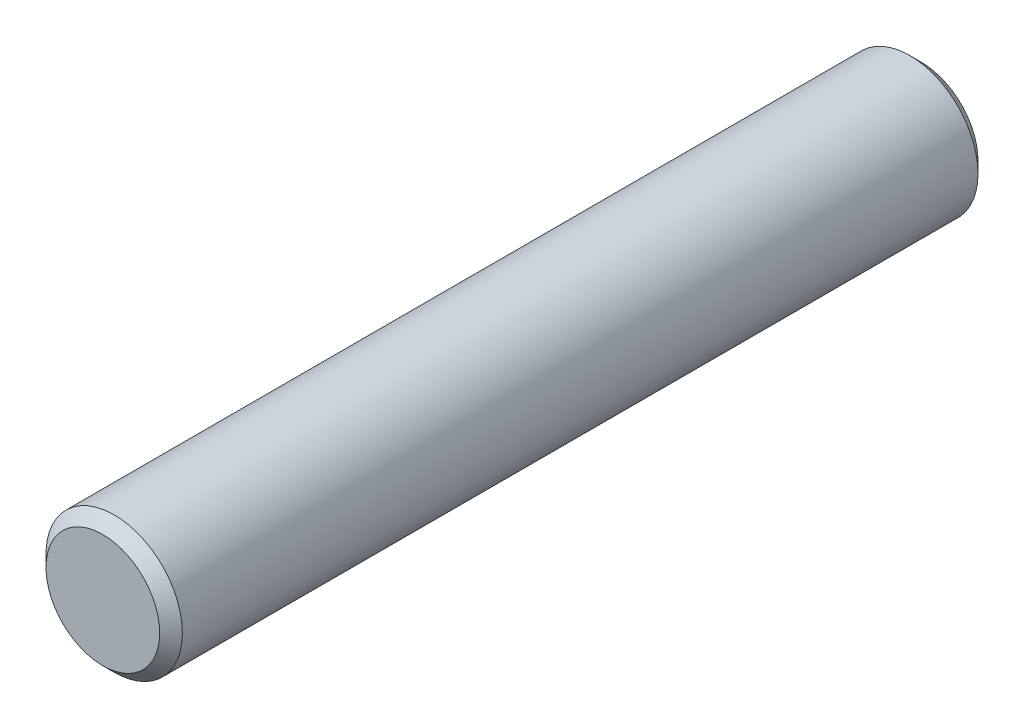
ISO-10303-21;
HEADER;
FILE_DESCRIPTION(('STEP AP214'),'2;1');
FILE_NAME('part.step','',(''),(''),'','','');
FILE_SCHEMA(('AUTOMOTIVE_DESIGN { 1 0 10303 214 1 1 1 1 }'));
ENDSEC;
DATA;
#1=APPLICATION_CONTEXT('core data for automotive mechanical design processes');
#2=APPLICATION_PROTOCOL_DEFINITION('international standard','automotive_design',2000,#1);
#3=PRODUCT_CONTEXT('',#1,'mechanical');
#4=PRODUCT('Part','Part','',(#3));
#5=PRODUCT_RELATED_PRODUCT_CATEGORY('part','',(#4));
#6=PRODUCT_DEFINITION_FORMATION('','',#4);
#7=PRODUCT_DEFINITION_CONTEXT('part definition',#1,'design');
#8=PRODUCT_DEFINITION('design','',#6,#7);
#9=PRODUCT_DEFINITION_SHAPE('','',#8);
#10=(LENGTH_UNIT() NAMED_UNIT(*) SI_UNIT(.MILLI.,.METRE.));
#11=(NAMED_UNIT(*) PLANE_ANGLE_UNIT() SI_UNIT($,.RADIAN.));
#12=(NAMED_UNIT(*) SI_UNIT($,.STERADIAN.) SOLID_ANGLE_UNIT());
#13=UNCERTAINTY_MEASURE_WITH_UNIT(LENGTH_MEASURE(1.E-05),#10,'distance_accuracy_value','');
#14=(GEOMETRIC_REPRESENTATION_CONTEXT(3) GLOBAL_UNCERTAINTY_ASSIGNED_CONTEXT((#13)) GLOBAL_UNIT_ASSIGNED_CONTEXT((#10,
#11,#12)) REPRESENTATION_CONTEXT('',''));
#15=CARTESIAN_POINT('',(0.,0.,0.));
#16=DIRECTION('',(0.,0.,1.));
#17=DIRECTION('',(1.,0.,0.));
#18=AXIS2_PLACEMENT_3D('',#15,#16,#17);
#19=CARTESIAN_POINT('',(0.,0.,36.));
#20=DIRECTION('',(0.,0.,-1.));
#21=DIRECTION('',(-1.,0.,0.));
#22=AXIS2_PLACEMENT_3D('',#19,#20,#21);
#23=CYLINDRICAL_SURFACE('',#22,3.);
#24=CARTESIAN_POINT('',(0.,0.,0.5));
#25=DIRECTION('',(0.,0.,1.));
#26=DIRECTION('',(1.,0.,0.));
#27=AXIS2_PLACEMENT_3D('',#24,#25,#26);
#28=CIRCLE('',#27,3.);
#29=CARTESIAN_POINT('',(3.,0.,0.5));
#30=VERTEX_POINT('',#29);
#31=EDGE_CURVE('E53',#30,#30,#28,.T.);
#32=ORIENTED_EDGE('',*,*,#31,.T.);
#33=EDGE_LOOP('',(#32));
#34=FACE_BOUND('',#33,.T.);
#35=CARTESIAN_POINT('',(0.,0.,35.5));
#36=DIRECTION('',(0.,0.,1.));
#37=DIRECTION('',(1.,0.,0.));
#38=AXIS2_PLACEMENT_3D('',#35,#36,#37);
#39=CIRCLE('',#38,3.);
#40=CARTESIAN_POINT('',(3.,0.,35.5));
#41=VERTEX_POINT('',#40);
#42=EDGE_CURVE('E58',#41,#41,#39,.F.);
#43=ORIENTED_EDGE('',*,*,#42,.T.);
#44=EDGE_LOOP('',(#43));
#45=FACE_BOUND('',#44,.T.);
#46=ADVANCED_FACE('F39',(#34,#45),#23,.T.);
#47=CARTESIAN_POINT('',(0.,0.,36.));
#48=DIRECTION('',(0.,0.,1.));
#49=DIRECTION('',(1.,0.,0.));
#50=AXIS2_PLACEMENT_3D('',#47,#48,#49);
#51=PLANE('',#50);
#52=CARTESIAN_POINT('',(0.,0.,36.));
#53=DIRECTION('',(0.,0.,1.));
#54=DIRECTION('',(1.,0.,0.));
#55=AXIS2_PLACEMENT_3D('',#52,#53,#54);
#56=CIRCLE('',#55,2.50000000000001);
#57=CARTESIAN_POINT('',(2.50000000000001,0.,36.));
#58=VERTEX_POINT('',#57);
#59=EDGE_CURVE('E10',#58,#58,#56,.T.);
#60=ORIENTED_EDGE('',*,*,#59,.T.);
#61=EDGE_LOOP('',(#60));
#62=FACE_BOUND('',#61,.T.);
#63=ADVANCED_FACE('F75',(#62),#51,.T.);
#64=CARTESIAN_POINT('',(0.,0.,0.));
#65=DIRECTION('',(0.,0.,1.));
#66=DIRECTION('',(1.,0.,0.));
#67=AXIS2_PLACEMENT_3D('',#64,#65,#66);
#68=PLANE('',#67);
#69=CARTESIAN_POINT('',(0.,0.,0.));
#70=DIRECTION('',(0.,0.,1.));
#71=DIRECTION('',(1.,0.,0.));
#72=AXIS2_PLACEMENT_3D('',#69,#70,#71);
#73=CIRCLE('',#72,2.5);
#74=CARTESIAN_POINT('',(2.5,0.,0.));
#75=VERTEX_POINT('',#74);
#76=EDGE_CURVE('E48',#75,#75,#73,.F.);
#77=ORIENTED_EDGE('',*,*,#76,.T.);
#78=EDGE_LOOP('',(#77));
#79=FACE_BOUND('',#78,.T.);
#80=ADVANCED_FACE('F72',(#79),#68,.F.);
#81=CARTESIAN_POINT('',(0.,0.,0.5));
#82=DIRECTION('',(0.,0.,1.));
#83=DIRECTION('',(1.,0.,0.));
#84=AXIS2_PLACEMENT_3D('',#81,#82,#83);
#85=CONICAL_SURFACE('',#84,3.,0.785398163397446);
#86=ORIENTED_EDGE('',*,*,#76,.F.);
#87=EDGE_LOOP('',(#86));
#88=FACE_BOUND('',#87,.T.);
#89=ORIENTED_EDGE('',*,*,#31,.F.);
#90=EDGE_LOOP('',(#89));
#91=FACE_BOUND('',#90,.T.);
#92=ADVANCED_FACE('F68',(#88,#91),#85,.T.);
#93=CARTESIAN_POINT('',(0.,0.,36.));
#94=DIRECTION('',(0.,0.,-1.));
#95=DIRECTION('',(-1.,0.,0.));
#96=AXIS2_PLACEMENT_3D('',#93,#94,#95);
#97=CONICAL_SURFACE('',#96,2.50000000000001,0.78539816339745);
#98=ORIENTED_EDGE('',*,*,#42,.F.);
#99=EDGE_LOOP('',(#98));
#100=FACE_BOUND('',#99,.T.);
#101=ORIENTED_EDGE('',*,*,#59,.F.);
#102=EDGE_LOOP('',(#101));
#103=FACE_BOUND('',#102,.T.);
#104=ADVANCED_FACE('F42',(#100,#103),#97,.T.);
#105=CLOSED_SHELL('',(#46,#63,#80,#92,#104));
#106=MANIFOLD_SOLID_BREP('B2',#105);
#107=ADVANCED_BREP_SHAPE_REPRESENTATION('',(#18,#106),#14);
#108=SHAPE_DEFINITION_REPRESENTATION(#9,#107);
ENDSEC;
END-ISO-10303-21;
